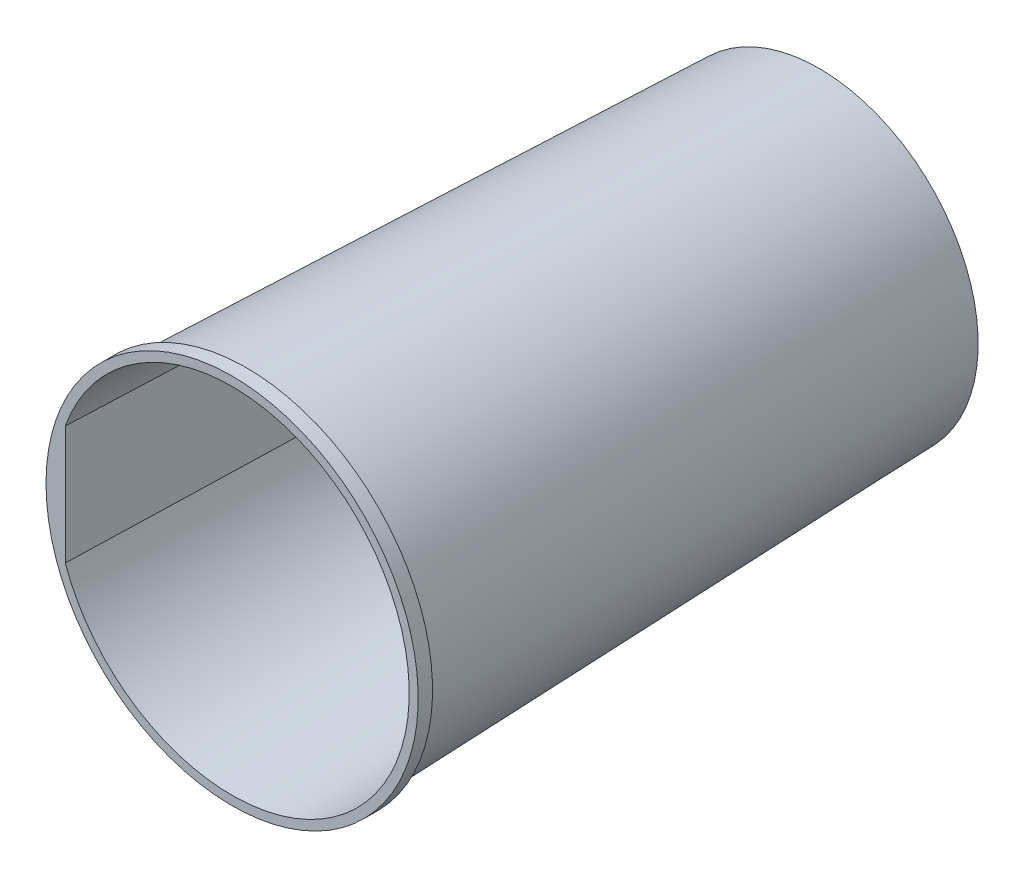
ISO-10303-21;
HEADER;
FILE_DESCRIPTION(('STEP AP214'),'2;1');
FILE_NAME('part.step','',(''),(''),'','','');
FILE_SCHEMA(('AUTOMOTIVE_DESIGN { 1 0 10303 214 1 1 1 1 }'));
ENDSEC;
DATA;
#1=APPLICATION_CONTEXT('core data for automotive mechanical design processes');
#2=APPLICATION_PROTOCOL_DEFINITION('international standard','automotive_design',2000,#1);
#3=PRODUCT_CONTEXT('',#1,'mechanical');
#4=PRODUCT('Part','Part','',(#3));
#5=PRODUCT_RELATED_PRODUCT_CATEGORY('part','',(#4));
#6=PRODUCT_DEFINITION_FORMATION('','',#4);
#7=PRODUCT_DEFINITION_CONTEXT('part definition',#1,'design');
#8=PRODUCT_DEFINITION('design','',#6,#7);
#9=PRODUCT_DEFINITION_SHAPE('','',#8);
#10=(LENGTH_UNIT() NAMED_UNIT(*) SI_UNIT(.MILLI.,.METRE.));
#11=(NAMED_UNIT(*) PLANE_ANGLE_UNIT() SI_UNIT($,.RADIAN.));
#12=(NAMED_UNIT(*) SI_UNIT($,.STERADIAN.) SOLID_ANGLE_UNIT());
#13=UNCERTAINTY_MEASURE_WITH_UNIT(LENGTH_MEASURE(1.E-05),#10,'distance_accuracy_value','');
#14=(GEOMETRIC_REPRESENTATION_CONTEXT(3) GLOBAL_UNCERTAINTY_ASSIGNED_CONTEXT((#13)) GLOBAL_UNIT_ASSIGNED_CONTEXT((#10,
#11,#12)) REPRESENTATION_CONTEXT('',''));
#15=CARTESIAN_POINT('',(0.,0.,0.));
#16=DIRECTION('',(0.,0.,1.));
#17=DIRECTION('',(1.,0.,0.));
#18=AXIS2_PLACEMENT_3D('',#15,#16,#17);
#19=CARTESIAN_POINT('',(0.,0.,0.));
#20=DIRECTION('',(0.,0.,1.));
#21=DIRECTION('',(1.,0.,0.));
#22=AXIS2_PLACEMENT_3D('',#19,#20,#21);
#23=CONICAL_SURFACE('',#22,75.,0.0349065850398866);
#24=CARTESIAN_POINT('',(0.,0.,0.));
#25=DIRECTION('',(0.,0.,1.));
#26=DIRECTION('',(1.,0.,0.));
#27=AXIS2_PLACEMENT_3D('',#24,#25,#26);
#28=CIRCLE('',#27,75.);
#29=CARTESIAN_POINT('',(-70.7106781186548,-25.,0.));
#30=VERTEX_POINT('',#29);
#31=CARTESIAN_POINT('',(-70.7106781186548,25.,0.));
#32=VERTEX_POINT('',#31);
#33=EDGE_CURVE('E125',#30,#32,#28,.T.);
#34=ORIENTED_EDGE('',*,*,#33,.F.);
#35=CARTESIAN_POINT('',(-62.3296934406353,-23.5181316874173,-240.));
#36=CARTESIAN_POINT('',(-63.0785336412022,-23.6547061869577,-218.556022348136));
#37=CARTESIAN_POINT('',(-63.8273741048995,-23.7900943978907,-197.112037161204));
#38=CARTESIAN_POINT('',(-65.3250555189861,-24.058609853554,-154.224052850305));
#39=CARTESIAN_POINT('',(-66.0738964693754,-24.1917370983058,-132.780053726339));
#40=CARTESIAN_POINT('',(-67.4707273924758,-24.4380578346008,-92.780049619026));
#41=CARTESIAN_POINT('',(-68.1187173072418,-24.5515213015319,-74.2240462950134));
#42=CARTESIAN_POINT('',(-69.414697469368,-24.7769032680916,-37.1120301227332));
#43=CARTESIAN_POINT('',(-70.0626877167283,-24.8888217677075,-18.5560172744655));
#44=CARTESIAN_POINT('',(-70.7106781186548,-25.,0.));
#45=B_SPLINE_CURVE_WITH_KNOTS('',3,(#35,#36,#37,#38,#39,#40,#41,#42,#43,#44),.UNSPECIFIED.,.F.,
.F.,(4,2,2,2,4),(0.,64.3724500061189,128.744899402081,184.447881469532,240.150863993777),.UNSPECIFIED.);
#46=CARTESIAN_POINT('',(-62.3296934406353,-23.5181316874173,-240.));
#47=VERTEX_POINT('',#46);
#48=EDGE_CURVE('E11',#47,#30,#45,.T.);
#49=ORIENTED_EDGE('',*,*,#48,.F.);
#50=CARTESIAN_POINT('',(0.,0.,-240.));
#51=DIRECTION('',(0.,0.,1.));
#52=DIRECTION('',(1.,0.,0.));
#53=AXIS2_PLACEMENT_3D('',#50,#51,#52);
#54=CIRCLE('',#53,66.6190153219805);
#55=CARTESIAN_POINT('',(-62.3296934406353,23.5181316874173,-240.));
#56=VERTEX_POINT('',#55);
#57=EDGE_CURVE('E135',#47,#56,#54,.T.);
#58=ORIENTED_EDGE('',*,*,#57,.T.);
#59=CARTESIAN_POINT('',(-62.3296934406353,23.5181316874173,-240.));
#60=CARTESIAN_POINT('',(-63.0785336412022,23.6547061869577,-218.556022348136));
#61=CARTESIAN_POINT('',(-63.8273741048995,23.7900943978907,-197.112037161204));
#62=CARTESIAN_POINT('',(-65.3250555189861,24.058609853554,-154.224052850305));
#63=CARTESIAN_POINT('',(-66.0738964693754,24.1917370983058,-132.780053726339));
#64=CARTESIAN_POINT('',(-67.4707273924758,24.4380578346008,-92.780049619026));
#65=CARTESIAN_POINT('',(-68.1187173072418,24.5515213015319,-74.2240462950134));
#66=CARTESIAN_POINT('',(-69.414697469368,24.7769032680916,-37.1120301227332));
#67=CARTESIAN_POINT('',(-70.0626877167283,24.8888217677075,-18.5560172744655));
#68=CARTESIAN_POINT('',(-70.7106781186548,25.,0.));
#69=B_SPLINE_CURVE_WITH_KNOTS('',3,(#59,#60,#61,#62,#63,#64,#65,#66,#67,#68),.UNSPECIFIED.,.F.,
.F.,(4,2,2,2,4),(0.,64.3724500061189,128.744899402081,184.447881469532,240.150863993777),.UNSPECIFIED.);
#70=EDGE_CURVE('E55',#56,#32,#69,.T.);
#71=ORIENTED_EDGE('',*,*,#70,.T.);
#72=EDGE_LOOP('',(#34,#49,#58,#71));
#73=FACE_BOUND('',#72,.T.);
#74=ADVANCED_FACE('F45',(#73),#23,.T.);
#75=CARTESIAN_POINT('',(-70.7106781186548,-25.,0.));
#76=DIRECTION('',(-0.999390827019096,0.,-0.034899496702501));
#77=DIRECTION('',(-0.034899496702501,0.,0.999390827019096));
#78=AXIS2_PLACEMENT_3D('',#75,#76,#77);
#79=PLANE('',#78);
#80=DIRECTION('',(0.,-1.,0.));
#81=VECTOR('',#80,1.);
#82=CARTESIAN_POINT('',(-70.7106781186548,-25.,0.));
#83=LINE('',#82,#81);
#84=EDGE_CURVE('E132',#32,#30,#83,.T.);
#85=ORIENTED_EDGE('',*,*,#84,.F.);
#86=ORIENTED_EDGE('',*,*,#70,.F.);
#87=DIRECTION('',(0.,-1.,0.));
#88=VECTOR('',#87,1.);
#89=CARTESIAN_POINT('',(-62.3296934406353,0.,-240.));
#90=LINE('',#89,#88);
#91=EDGE_CURVE('E49',#56,#47,#90,.T.);
#92=ORIENTED_EDGE('',*,*,#91,.T.);
#93=ORIENTED_EDGE('',*,*,#48,.T.);
#94=EDGE_LOOP('',(#85,#86,#92,#93));
#95=FACE_BOUND('',#94,.T.);
#96=ADVANCED_FACE('F145',(#95),#79,.T.);
#97=CARTESIAN_POINT('',(0.,0.,-240.));
#98=DIRECTION('',(0.,0.,1.));
#99=DIRECTION('',(1.,0.,0.));
#100=AXIS2_PLACEMENT_3D('',#97,#98,#99);
#101=PLANE('',#100);
#102=ORIENTED_EDGE('',*,*,#57,.F.);
#103=ORIENTED_EDGE('',*,*,#91,.F.);
#104=EDGE_LOOP('',(#102,#103));
#105=FACE_BOUND('',#104,.T.);
#106=ADVANCED_FACE('F149',(#105),#101,.F.);
#107=CARTESIAN_POINT('',(0.,0.,0.));
#108=DIRECTION('',(0.,0.,1.));
#109=DIRECTION('',(1.,0.,0.));
#110=AXIS2_PLACEMENT_3D('',#107,#108,#109);
#111=PLANE('',#110);
#112=CARTESIAN_POINT('',(0.,0.,0.));
#113=DIRECTION('',(0.,0.,1.));
#114=DIRECTION('',(1.,0.,0.));
#115=AXIS2_PLACEMENT_3D('',#112,#113,#114);
#116=CIRCLE('',#115,77.9866095511446);
#117=CARTESIAN_POINT('',(-77.9866095511446,0.,0.));
#118=VERTEX_POINT('',#117);
#119=EDGE_CURVE('E120',#118,#118,#116,.T.);
#120=ORIENTED_EDGE('',*,*,#119,.F.);
#121=EDGE_LOOP('',(#120));
#122=FACE_BOUND('',#121,.T.);
#123=ORIENTED_EDGE('',*,*,#84,.T.);
#124=ORIENTED_EDGE('',*,*,#33,.T.);
#125=EDGE_LOOP('',(#123,#124));
#126=FACE_BOUND('',#125,.T.);
#127=ADVANCED_FACE('F154',(#122,#126),#111,.F.);
#128=CARTESIAN_POINT('',(0.,0.,5.99999999999994));
#129=DIRECTION('',(0.,0.,-1.));
#130=DIRECTION('',(-1.,0.,0.));
#131=AXIS2_PLACEMENT_3D('',#128,#129,#130);
#132=CYLINDRICAL_SURFACE('',#131,77.9866095511446);
#133=CARTESIAN_POINT('',(0.,0.,5.99999999999994));
#134=DIRECTION('',(0.,0.,1.));
#135=DIRECTION('',(1.,0.,0.));
#136=AXIS2_PLACEMENT_3D('',#133,#134,#135);
#137=CIRCLE('',#136,77.9866095511446);
#138=CARTESIAN_POINT('',(-77.9866095511446,0.,5.99999999999994));
#139=VERTEX_POINT('',#138);
#140=EDGE_CURVE('E121',#139,#139,#137,.T.);
#141=CARTESIAN_POINT('',(-77.9866095511446,0.,5.99999999999994));
#142=CARTESIAN_POINT('',(-77.9866095511446,0.,5.93749999999995));
#143=CARTESIAN_POINT('',(-77.9866095511446,0.,5.87499999999994));
#144=CARTESIAN_POINT('',(-77.9866095511446,0.,5.74999999999995));
#145=CARTESIAN_POINT('',(-77.9866095511446,0.,5.68749999999995));
#146=CARTESIAN_POINT('',(-77.9866095511446,0.,5.56249999999995));
#147=CARTESIAN_POINT('',(-77.9866095511446,0.,5.49999999999995));
#148=CARTESIAN_POINT('',(-77.9866095511446,0.,5.37499999999995));
#149=CARTESIAN_POINT('',(-77.9866095511446,0.,5.31249999999995));
#150=CARTESIAN_POINT('',(-77.9866095511446,0.,5.18749999999995));
#151=CARTESIAN_POINT('',(-77.9866095511446,0.,5.12499999999995));
#152=CARTESIAN_POINT('',(-77.9866095511446,0.,4.99999999999995));
#153=CARTESIAN_POINT('',(-77.9866095511446,0.,4.93749999999995));
#154=CARTESIAN_POINT('',(-77.9866095511446,0.,4.81249999999995));
#155=CARTESIAN_POINT('',(-77.9866095511446,0.,4.74999999999996));
#156=CARTESIAN_POINT('',(-77.9866095511446,0.,4.62499999999996));
#157=CARTESIAN_POINT('',(-77.9866095511446,0.,4.56249999999996));
#158=CARTESIAN_POINT('',(-77.9866095511446,0.,4.43749999999996));
#159=CARTESIAN_POINT('',(-77.9866095511446,0.,4.37499999999996));
#160=CARTESIAN_POINT('',(-77.9866095511446,0.,4.24999999999996));
#161=CARTESIAN_POINT('',(-77.9866095511446,0.,4.18749999999996));
#162=CARTESIAN_POINT('',(-77.9866095511446,0.,4.06249999999996));
#163=CARTESIAN_POINT('',(-77.9866095511446,0.,3.99999999999996));
#164=CARTESIAN_POINT('',(-77.9866095511446,0.,3.87499999999996));
#165=CARTESIAN_POINT('',(-77.9866095511446,0.,3.81249999999996));
#166=CARTESIAN_POINT('',(-77.9866095511446,0.,3.68749999999996));
#167=CARTESIAN_POINT('',(-77.9866095511446,0.,3.62499999999997));
#168=CARTESIAN_POINT('',(-77.9866095511446,0.,3.49999999999997));
#169=CARTESIAN_POINT('',(-77.9866095511446,0.,3.43749999999997));
#170=CARTESIAN_POINT('',(-77.9866095511446,0.,3.31249999999997));
#171=CARTESIAN_POINT('',(-77.9866095511446,0.,3.24999999999997));
#172=CARTESIAN_POINT('',(-77.9866095511446,0.,3.12499999999997));
#173=CARTESIAN_POINT('',(-77.9866095511446,0.,3.06249999999997));
#174=CARTESIAN_POINT('',(-77.9866095511446,0.,2.93749999999997));
#175=CARTESIAN_POINT('',(-77.9866095511446,0.,2.87499999999997));
#176=CARTESIAN_POINT('',(-77.9866095511446,0.,2.74999999999997));
#177=CARTESIAN_POINT('',(-77.9866095511446,0.,2.68749999999997));
#178=CARTESIAN_POINT('',(-77.9866095511446,0.,2.56249999999998));
#179=CARTESIAN_POINT('',(-77.9866095511446,0.,2.49999999999998));
#180=CARTESIAN_POINT('',(-77.9866095511446,0.,2.37499999999998));
#181=CARTESIAN_POINT('',(-77.9866095511446,0.,2.31249999999998));
#182=CARTESIAN_POINT('',(-77.9866095511446,0.,2.18749999999998));
#183=CARTESIAN_POINT('',(-77.9866095511446,0.,2.12499999999998));
#184=CARTESIAN_POINT('',(-77.9866095511446,0.,1.99999999999998));
#185=CARTESIAN_POINT('',(-77.9866095511446,0.,1.93749999999998));
#186=CARTESIAN_POINT('',(-77.9866095511446,0.,1.81249999999998));
#187=CARTESIAN_POINT('',(-77.9866095511446,0.,1.74999999999998));
#188=CARTESIAN_POINT('',(-77.9866095511446,0.,1.62499999999998));
#189=CARTESIAN_POINT('',(-77.9866095511446,0.,1.56249999999999));
#190=CARTESIAN_POINT('',(-77.9866095511446,0.,1.43749999999999));
#191=CARTESIAN_POINT('',(-77.9866095511446,0.,1.37499999999999));
#192=CARTESIAN_POINT('',(-77.9866095511446,0.,1.24999999999999));
#193=CARTESIAN_POINT('',(-77.9866095511446,0.,1.18749999999999));
#194=CARTESIAN_POINT('',(-77.9866095511446,0.,1.06249999999999));
#195=CARTESIAN_POINT('',(-77.9866095511446,0.,0.99999999999999));
#196=CARTESIAN_POINT('',(-77.9866095511446,0.,0.874999999999991));
#197=CARTESIAN_POINT('',(-77.9866095511446,0.,0.812499999999992));
#198=CARTESIAN_POINT('',(-77.9866095511446,0.,0.687499999999993));
#199=CARTESIAN_POINT('',(-77.9866095511446,0.,0.624999999999994));
#200=CARTESIAN_POINT('',(-77.9866095511446,0.,0.499999999999995));
#201=CARTESIAN_POINT('',(-77.9866095511446,0.,0.437499999999995));
#202=CARTESIAN_POINT('',(-77.9866095511446,0.,0.312499999999997));
#203=CARTESIAN_POINT('',(-77.9866095511446,0.,0.249999999999997));
#204=CARTESIAN_POINT('',(-77.9866095511446,0.,0.124999999999998));
#205=CARTESIAN_POINT('',(-77.9866095511446,0.,0.0624999999999985));
#206=CARTESIAN_POINT('',(-77.9866095511446,0.,0.));
#207=B_SPLINE_CURVE_WITH_KNOTS('',3,(#141,#142,#143,#144,#145,#146,#147,#148,#149,#150,#151,
#152,#153,#154,#155,#156,#157,#158,#159,#160,#161,#162,#163,#164,#165,#166,#167,#168,#169,#170,
#171,#172,#173,#174,#175,#176,#177,#178,#179,#180,#181,#182,#183,#184,#185,#186,#187,#188,#189,
#190,#191,#192,#193,#194,#195,#196,#197,#198,#199,#200,#201,#202,#203,#204,#205,#206),
.UNSPECIFIED.,.F.,.F.,(4,2,2,2,2,2,2,2,2,2,2,2,2,2,2,2,2,2,2,2,2,2,2,2,2,2,2,2,2,2,2,2,4),(0.,
0.187499999999998,0.374999999999997,0.562499999999995,0.749999999999994,0.937499999999992,
1.12499999999999,1.31249999999999,1.49999999999999,1.68749999999999,1.87499999999998,
2.06249999999998,2.24999999999998,2.43749999999998,2.62499999999998,2.81249999999997,
2.99999999999997,3.18749999999997,3.37499999999997,3.56249999999997,3.74999999999997,
3.93749999999996,4.12499999999996,4.31249999999996,4.49999999999996,4.68749999999996,
4.87499999999996,5.06249999999995,5.24999999999995,5.43749999999995,5.62499999999995,
5.81249999999995,5.99999999999995),.UNSPECIFIED.);
#208=EDGE_CURVE('BSEAM156',#139,#118,#207,.T.);
#209=ORIENTED_EDGE('',*,*,#140,.F.);
#210=ORIENTED_EDGE('',*,*,#119,.T.);
#211=ORIENTED_EDGE('',*,*,#208,.T.);
#212=ORIENTED_EDGE('',*,*,#208,.F.);
#213=EDGE_LOOP('',(#209,#211,#210,#212));
#214=FACE_BOUND('',#213,.T.);
#215=ADVANCED_FACE('F156',(#214),#132,.T.);
#216=CARTESIAN_POINT('',(0.,0.,5.99999999999994));
#217=DIRECTION('',(0.,0.,1.));
#218=DIRECTION('',(1.,0.,0.));
#219=AXIS2_PLACEMENT_3D('',#216,#217,#218);
#220=PLANE('',#219);
#221=DIRECTION('',(0.,-1.,0.));
#222=VECTOR('',#221,1.);
#223=CARTESIAN_POINT('',(-69.9195931913064,0.,5.99999999999994));
#224=LINE('',#223,#222);
#225=CARTESIAN_POINT('',(-69.9195931913064,24.8639008247347,5.99999999999994));
#226=VERTEX_POINT('',#225);
#227=CARTESIAN_POINT('',(-69.9195931913064,-24.8639008247347,5.99999999999994));
#228=VERTEX_POINT('',#227);
#229=EDGE_CURVE('E92',#226,#228,#224,.T.);
#230=ORIENTED_EDGE('',*,*,#229,.F.);
#231=CARTESIAN_POINT('',(0.,0.,5.99999999999994));
#232=DIRECTION('',(0.,0.,1.));
#233=DIRECTION('',(1.,0.,0.));
#234=AXIS2_PLACEMENT_3D('',#231,#232,#233);
#235=CIRCLE('',#234,74.2089150726517);
#236=EDGE_CURVE('E117',#228,#226,#235,.T.);
#237=ORIENTED_EDGE('',*,*,#236,.F.);
#238=EDGE_LOOP('',(#230,#237));
#239=FACE_BOUND('',#238,.T.);
#240=ORIENTED_EDGE('',*,*,#140,.T.);
#241=EDGE_LOOP('',(#240));
#242=FACE_BOUND('',#241,.T.);
#243=ADVANCED_FACE('F159',(#239,#242),#220,.T.);
#244=CARTESIAN_POINT('',(0.,0.,0.034899496702501));
#245=DIRECTION('',(0.,0.,1.));
#246=DIRECTION('',(1.,0.,0.));
#247=AXIS2_PLACEMENT_3D('',#244,#245,#246);
#248=CONICAL_SURFACE('',#247,74.0006091729809,0.0349065850398866);
#249=ORIENTED_EDGE('',*,*,#236,.T.);
#250=CARTESIAN_POINT('',(-61.6782915912539,23.3990250577776,-230.));
#251=CARTESIAN_POINT('',(-62.4198094666129,23.5349525047597,-208.765706307412));
#252=CARTESIAN_POINT('',(-63.1613276052686,23.6696988898806,-187.53140507499));
#253=CARTESIAN_POINT('',(-64.644364369517,23.9369407045769,-145.062788666097));
#254=CARTESIAN_POINT('',(-65.3858829951097,24.0694361341741,-123.828473489626));
#255=CARTESIAN_POINT('',(-66.7827139040501,24.317008061759,-83.8284697878051));
#256=CARTESIAN_POINT('',(-67.4380261368515,24.4323188644859,-65.0627827099097));
#257=CARTESIAN_POINT('',(-68.7486509492225,24.6613375968857,-27.531398623981));
#258=CARTESIAN_POINT('',(-69.403963528792,24.7750455265449,-8.7657016159476));
#259=CARTESIAN_POINT('',(-70.0592762692734,24.8879861697929,9.99999999999997));
#260=B_SPLINE_CURVE_WITH_KNOTS('',3,(#250,#251,#252,#253,#254,#255,#256,#257,#258,#259),
.UNSPECIFIED.,.F.,.F.,(4,2,2,2,4),(0.,63.743015120937,127.486029625836,183.818468524584,
240.150907904376),.UNSPECIFIED.);
#261=CARTESIAN_POINT('',(-61.6782915912539,23.3990250577776,-230.));
#262=VERTEX_POINT('',#261);
#263=EDGE_CURVE('E95',#262,#226,#260,.T.);
#264=ORIENTED_EDGE('',*,*,#263,.F.);
#265=CARTESIAN_POINT('',(0.,0.,-230.));
#266=DIRECTION('',(0.,0.,1.));
#267=DIRECTION('',(1.,0.,0.));
#268=AXIS2_PLACEMENT_3D('',#265,#266,#267);
#269=CIRCLE('',#268,65.9676134725992);
#270=CARTESIAN_POINT('',(-61.6782915912539,-23.3990250577776,-230.));
#271=VERTEX_POINT('',#270);
#272=EDGE_CURVE('E98',#271,#262,#269,.T.);
#273=ORIENTED_EDGE('',*,*,#272,.F.);
#274=CARTESIAN_POINT('',(-61.6782915912539,-23.3990250577776,-230.));
#275=CARTESIAN_POINT('',(-62.4198094666129,-23.5349525047597,-208.765706307412));
#276=CARTESIAN_POINT('',(-63.1613276052686,-23.6696988898806,-187.53140507499));
#277=CARTESIAN_POINT('',(-64.644364369517,-23.9369407045769,-145.062788666097));
#278=CARTESIAN_POINT('',(-65.3858829951097,-24.0694361341741,-123.828473489626));
#279=CARTESIAN_POINT('',(-66.7827139040501,-24.317008061759,-83.8284697878051));
#280=CARTESIAN_POINT('',(-67.4380261368515,-24.4323188644859,-65.0627827099097));
#281=CARTESIAN_POINT('',(-68.7486509492225,-24.6613375968857,-27.531398623981));
#282=CARTESIAN_POINT('',(-69.403963528792,-24.7750455265449,-8.7657016159476));
#283=CARTESIAN_POINT('',(-70.0592762692734,-24.8879861697929,9.99999999999997));
#284=B_SPLINE_CURVE_WITH_KNOTS('',3,(#274,#275,#276,#277,#278,#279,#280,#281,#282,#283),
.UNSPECIFIED.,.F.,.F.,(4,2,2,2,4),(0.,63.743015120937,127.486029625836,183.818468524584,
240.150907904376),.UNSPECIFIED.);
#285=EDGE_CURVE('E63',#271,#228,#284,.T.);
#286=ORIENTED_EDGE('',*,*,#285,.T.);
#287=EDGE_LOOP('',(#249,#264,#273,#286));
#288=FACE_BOUND('',#287,.T.);
#289=ADVANCED_FACE('F99',(#288),#248,.F.);
#290=CARTESIAN_POINT('',(-69.7112872916357,-25.,0.034899496702501));
#291=DIRECTION('',(-0.999390827019096,0.,-0.034899496702501));
#292=DIRECTION('',(-0.034899496702501,0.,0.999390827019096));
#293=AXIS2_PLACEMENT_3D('',#290,#291,#292);
#294=PLANE('',#293);
#295=ORIENTED_EDGE('',*,*,#229,.T.);
#296=ORIENTED_EDGE('',*,*,#285,.F.);
#297=DIRECTION('',(0.,-1.,0.));
#298=VECTOR('',#297,1.);
#299=CARTESIAN_POINT('',(-61.6782915912539,0.,-230.));
#300=LINE('',#299,#298);
#301=EDGE_CURVE('E90',#262,#271,#300,.T.);
#302=ORIENTED_EDGE('',*,*,#301,.F.);
#303=ORIENTED_EDGE('',*,*,#263,.T.);
#304=EDGE_LOOP('',(#295,#296,#302,#303));
#305=FACE_BOUND('',#304,.T.);
#306=ADVANCED_FACE('F87',(#305),#294,.F.);
#307=CARTESIAN_POINT('',(0.,0.,-230.));
#308=DIRECTION('',(0.,0.,1.));
#309=DIRECTION('',(1.,0.,0.));
#310=AXIS2_PLACEMENT_3D('',#307,#308,#309);
#311=PLANE('',#310);
#312=ORIENTED_EDGE('',*,*,#272,.T.);
#313=ORIENTED_EDGE('',*,*,#301,.T.);
#314=EDGE_LOOP('',(#312,#313));
#315=FACE_BOUND('',#314,.T.);
#316=ADVANCED_FACE('F103',(#315),#311,.T.);
#317=CLOSED_SHELL('',(#74,#96,#106,#127,#215,#243,#289,#306,#316));
#318=MANIFOLD_SOLID_BREP('B2',#317);
#319=ADVANCED_BREP_SHAPE_REPRESENTATION('',(#18,#318),#14);
#320=SHAPE_DEFINITION_REPRESENTATION(#9,#319);
ENDSEC;
END-ISO-10303-21;
